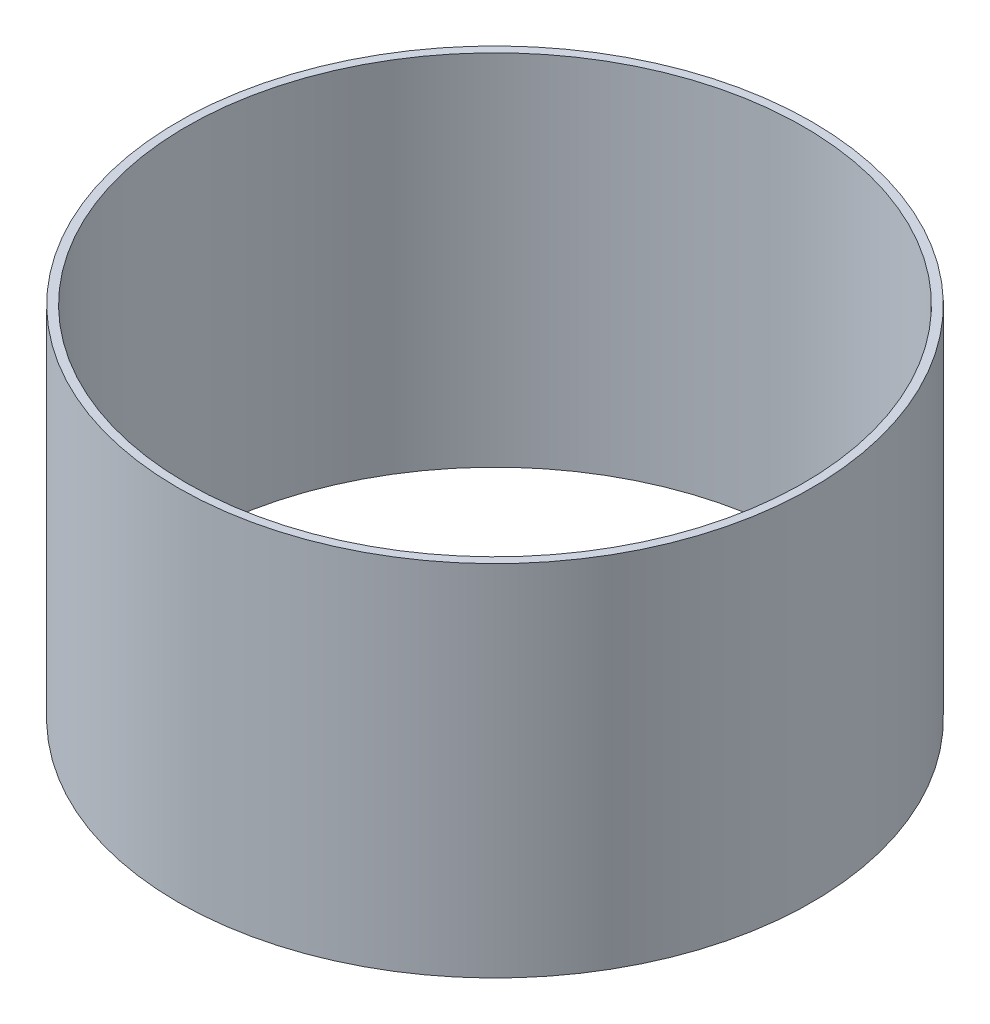
ISO-10303-21;
HEADER;
FILE_DESCRIPTION(('STEP AP214'),'2;1');
FILE_NAME('part.step','',(''),(''),'','','');
FILE_SCHEMA(('AUTOMOTIVE_DESIGN { 1 0 10303 214 1 1 1 1 }'));
ENDSEC;
DATA;
#1=APPLICATION_CONTEXT('core data for automotive mechanical design processes');
#2=APPLICATION_PROTOCOL_DEFINITION('international standard','automotive_design',2000,#1);
#3=PRODUCT_CONTEXT('',#1,'mechanical');
#4=PRODUCT('Part','Part','',(#3));
#5=PRODUCT_RELATED_PRODUCT_CATEGORY('part','',(#4));
#6=PRODUCT_DEFINITION_FORMATION('','',#4);
#7=PRODUCT_DEFINITION_CONTEXT('part definition',#1,'design');
#8=PRODUCT_DEFINITION('design','',#6,#7);
#9=PRODUCT_DEFINITION_SHAPE('','',#8);
#10=(LENGTH_UNIT() NAMED_UNIT(*) SI_UNIT(.MILLI.,.METRE.));
#11=(NAMED_UNIT(*) PLANE_ANGLE_UNIT() SI_UNIT($,.RADIAN.));
#12=(NAMED_UNIT(*) SI_UNIT($,.STERADIAN.) SOLID_ANGLE_UNIT());
#13=UNCERTAINTY_MEASURE_WITH_UNIT(LENGTH_MEASURE(1.E-05),#10,'distance_accuracy_value','');
#14=(GEOMETRIC_REPRESENTATION_CONTEXT(3) GLOBAL_UNCERTAINTY_ASSIGNED_CONTEXT((#13)) GLOBAL_UNIT_ASSIGNED_CONTEXT((#10,
#11,#12)) REPRESENTATION_CONTEXT('',''));
#15=CARTESIAN_POINT('',(0.,0.,0.));
#16=DIRECTION('',(0.,0.,1.));
#17=DIRECTION('',(1.,0.,0.));
#18=AXIS2_PLACEMENT_3D('',#15,#16,#17);
#19=CARTESIAN_POINT('',(0.,150.,0.));
#20=DIRECTION('',(0.,1.,0.));
#21=DIRECTION('',(0.,0.,1.));
#22=AXIS2_PLACEMENT_3D('',#19,#20,#21);
#23=PLANE('',#22);
#24=CARTESIAN_POINT('',(0.,150.,0.));
#25=DIRECTION('',(0.,1.,0.));
#26=DIRECTION('',(0.,0.,1.));
#27=AXIS2_PLACEMENT_3D('',#24,#25,#26);
#28=CIRCLE('',#27,265.);
#29=CARTESIAN_POINT('',(0.,150.,265.));
#30=VERTEX_POINT('',#29);
#31=EDGE_CURVE('E10',#30,#30,#28,.T.);
#32=ORIENTED_EDGE('',*,*,#31,.T.);
#33=EDGE_LOOP('',(#32));
#34=FACE_BOUND('',#33,.T.);
#35=CARTESIAN_POINT('',(0.,150.,0.));
#36=DIRECTION('',(0.,1.,0.));
#37=DIRECTION('',(0.,0.,1.));
#38=AXIS2_PLACEMENT_3D('',#35,#36,#37);
#39=CIRCLE('',#38,258.);
#40=CARTESIAN_POINT('',(0.,150.,258.));
#41=VERTEX_POINT('',#40);
#42=EDGE_CURVE('E41',#41,#41,#39,.T.);
#43=ORIENTED_EDGE('',*,*,#42,.F.);
#44=EDGE_LOOP('',(#43));
#45=FACE_BOUND('',#44,.T.);
#46=ADVANCED_FACE('F30',(#34,#45),#23,.T.);
#47=CARTESIAN_POINT('',(0.,-150.,0.));
#48=DIRECTION('',(0.,1.,0.));
#49=DIRECTION('',(0.,0.,1.));
#50=AXIS2_PLACEMENT_3D('',#47,#48,#49);
#51=PLANE('',#50);
#52=CARTESIAN_POINT('',(0.,-150.,0.));
#53=DIRECTION('',(0.,1.,0.));
#54=DIRECTION('',(0.,0.,1.));
#55=AXIS2_PLACEMENT_3D('',#52,#53,#54);
#56=CIRCLE('',#55,265.);
#57=CARTESIAN_POINT('',(0.,-150.,265.));
#58=VERTEX_POINT('',#57);
#59=EDGE_CURVE('E34',#58,#58,#56,.T.);
#60=ORIENTED_EDGE('',*,*,#59,.F.);
#61=EDGE_LOOP('',(#60));
#62=FACE_BOUND('',#61,.T.);
#63=CARTESIAN_POINT('',(0.,-150.,0.));
#64=DIRECTION('',(0.,1.,0.));
#65=DIRECTION('',(0.,0.,1.));
#66=AXIS2_PLACEMENT_3D('',#63,#64,#65);
#67=CIRCLE('',#66,258.);
#68=CARTESIAN_POINT('',(0.,-150.,258.));
#69=VERTEX_POINT('',#68);
#70=EDGE_CURVE('E43',#69,#69,#67,.T.);
#71=ORIENTED_EDGE('',*,*,#70,.T.);
#72=EDGE_LOOP('',(#71));
#73=FACE_BOUND('',#72,.T.);
#74=ADVANCED_FACE('F53',(#62,#73),#51,.F.);
#75=CARTESIAN_POINT('',(0.,150.,0.));
#76=DIRECTION('',(0.,-1.,0.));
#77=DIRECTION('',(0.,0.,-1.));
#78=AXIS2_PLACEMENT_3D('',#75,#76,#77);
#79=CYLINDRICAL_SURFACE('',#78,265.);
#80=ORIENTED_EDGE('',*,*,#31,.F.);
#81=EDGE_LOOP('',(#80));
#82=FACE_BOUND('',#81,.T.);
#83=ORIENTED_EDGE('',*,*,#59,.T.);
#84=EDGE_LOOP('',(#83));
#85=FACE_BOUND('',#84,.T.);
#86=ADVANCED_FACE('F32',(#82,#85),#79,.T.);
#87=CARTESIAN_POINT('',(0.,150.,0.));
#88=DIRECTION('',(0.,-1.,0.));
#89=DIRECTION('',(0.,0.,-1.));
#90=AXIS2_PLACEMENT_3D('',#87,#88,#89);
#91=CYLINDRICAL_SURFACE('',#90,258.);
#92=ORIENTED_EDGE('',*,*,#42,.T.);
#93=EDGE_LOOP('',(#92));
#94=FACE_BOUND('',#93,.T.);
#95=ORIENTED_EDGE('',*,*,#70,.F.);
#96=EDGE_LOOP('',(#95));
#97=FACE_BOUND('',#96,.T.);
#98=ADVANCED_FACE('F49',(#94,#97),#91,.F.);
#99=CLOSED_SHELL('',(#46,#74,#86,#98));
#100=MANIFOLD_SOLID_BREP('B2',#99);
#101=ADVANCED_BREP_SHAPE_REPRESENTATION('',(#18,#100),#14);
#102=SHAPE_DEFINITION_REPRESENTATION(#9,#101);
ENDSEC;
END-ISO-10303-21;
